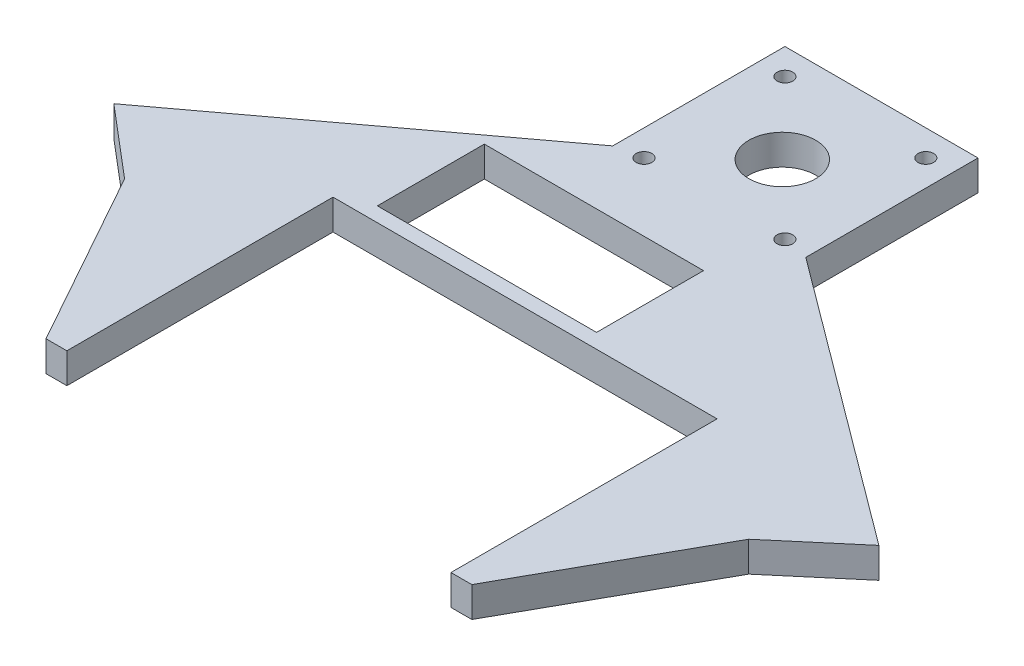
ISO-10303-21;
HEADER;
FILE_DESCRIPTION(('STEP AP214'),'2;1');
FILE_NAME('part.step','',(''),(''),'','','');
FILE_SCHEMA(('AUTOMOTIVE_DESIGN { 1 0 10303 214 1 1 1 1 }'));
ENDSEC;
DATA;
#1=APPLICATION_CONTEXT('core data for automotive mechanical design processes');
#2=APPLICATION_PROTOCOL_DEFINITION('international standard','automotive_design',2000,#1);
#3=PRODUCT_CONTEXT('',#1,'mechanical');
#4=PRODUCT('Part','Part','',(#3));
#5=PRODUCT_RELATED_PRODUCT_CATEGORY('part','',(#4));
#6=PRODUCT_DEFINITION_FORMATION('','',#4);
#7=PRODUCT_DEFINITION_CONTEXT('part definition',#1,'design');
#8=PRODUCT_DEFINITION('design','',#6,#7);
#9=PRODUCT_DEFINITION_SHAPE('','',#8);
#10=(LENGTH_UNIT() NAMED_UNIT(*) SI_UNIT(.MILLI.,.METRE.));
#11=(NAMED_UNIT(*) PLANE_ANGLE_UNIT() SI_UNIT($,.RADIAN.));
#12=(NAMED_UNIT(*) SI_UNIT($,.STERADIAN.) SOLID_ANGLE_UNIT());
#13=UNCERTAINTY_MEASURE_WITH_UNIT(LENGTH_MEASURE(1.E-05),#10,'distance_accuracy_value','');
#14=(GEOMETRIC_REPRESENTATION_CONTEXT(3) GLOBAL_UNCERTAINTY_ASSIGNED_CONTEXT((#13)) GLOBAL_UNIT_ASSIGNED_CONTEXT((#10,
#11,#12)) REPRESENTATION_CONTEXT('',''));
#15=CARTESIAN_POINT('',(0.,0.,0.));
#16=DIRECTION('',(0.,0.,1.));
#17=DIRECTION('',(1.,0.,0.));
#18=AXIS2_PLACEMENT_3D('',#15,#16,#17);
#19=CARTESIAN_POINT('',(0.,5.8,0.));
#20=DIRECTION('',(0.,0.,1.));
#21=DIRECTION('',(1.,0.,0.));
#22=AXIS2_PLACEMENT_3D('',#19,#20,#21);
#23=PLANE('',#22);
#24=DIRECTION('',(-1.,0.,0.));
#25=VECTOR('',#24,1.);
#26=CARTESIAN_POINT('',(0.,0.,0.));
#27=LINE('',#26,#25);
#28=CARTESIAN_POINT('',(18.5,0.,0.));
#29=VERTEX_POINT('',#28);
#30=CARTESIAN_POINT('',(-18.5,0.,0.));
#31=VERTEX_POINT('',#30);
#32=EDGE_CURVE('E302',#29,#31,#27,.T.);
#33=ORIENTED_EDGE('',*,*,#32,.T.);
#34=DIRECTION('',(0.,-1.,0.));
#35=VECTOR('',#34,1.);
#36=CARTESIAN_POINT('',(-18.5,5.8,0.));
#37=LINE('',#36,#35);
#38=CARTESIAN_POINT('',(-18.5,5.8,0.));
#39=VERTEX_POINT('',#38);
#40=EDGE_CURVE('E11',#39,#31,#37,.T.);
#41=ORIENTED_EDGE('',*,*,#40,.F.);
#42=DIRECTION('',(-1.,0.,0.));
#43=VECTOR('',#42,1.);
#44=CARTESIAN_POINT('',(0.,5.8,0.));
#45=LINE('',#44,#43);
#46=CARTESIAN_POINT('',(18.5,5.8,0.));
#47=VERTEX_POINT('',#46);
#48=EDGE_CURVE('E317',#47,#39,#45,.T.);
#49=ORIENTED_EDGE('',*,*,#48,.F.);
#50=DIRECTION('',(0.,-1.,0.));
#51=VECTOR('',#50,1.);
#52=CARTESIAN_POINT('',(18.5,5.8,0.));
#53=LINE('',#52,#51);
#54=EDGE_CURVE('E247',#47,#29,#53,.T.);
#55=ORIENTED_EDGE('',*,*,#54,.T.);
#56=EDGE_LOOP('',(#33,#41,#49,#55));
#57=FACE_BOUND('',#56,.T.);
#58=ADVANCED_FACE('F41',(#57),#23,.F.);
#59=CARTESIAN_POINT('',(-18.5,5.8,0.));
#60=DIRECTION('',(1.,0.,0.));
#61=DIRECTION('',(0.,0.,-1.));
#62=AXIS2_PLACEMENT_3D('',#59,#60,#61);
#63=PLANE('',#62);
#64=DIRECTION('',(0.,0.,1.));
#65=VECTOR('',#64,1.);
#66=CARTESIAN_POINT('',(-18.5,0.,0.));
#67=LINE('',#66,#65);
#68=CARTESIAN_POINT('',(-18.5,0.,33.));
#69=VERTEX_POINT('',#68);
#70=EDGE_CURVE('E345',#31,#69,#67,.T.);
#71=ORIENTED_EDGE('',*,*,#70,.T.);
#72=DIRECTION('',(0.,-1.,0.));
#73=VECTOR('',#72,1.);
#74=CARTESIAN_POINT('',(-18.5,5.8,33.));
#75=LINE('',#74,#73);
#76=CARTESIAN_POINT('',(-18.5,5.8,33.));
#77=VERTEX_POINT('',#76);
#78=EDGE_CURVE('E49',#77,#69,#75,.T.);
#79=ORIENTED_EDGE('',*,*,#78,.F.);
#80=DIRECTION('',(0.,0.,1.));
#81=VECTOR('',#80,1.);
#82=CARTESIAN_POINT('',(-18.5,5.8,0.));
#83=LINE('',#82,#81);
#84=EDGE_CURVE('E320',#39,#77,#83,.T.);
#85=ORIENTED_EDGE('',*,*,#84,.F.);
#86=ORIENTED_EDGE('',*,*,#40,.T.);
#87=EDGE_LOOP('',(#71,#79,#85,#86));
#88=FACE_BOUND('',#87,.T.);
#89=ADVANCED_FACE('F414',(#88),#63,.F.);
#90=CARTESIAN_POINT('',(-18.5,5.8,33.));
#91=DIRECTION('',(0.59712909838521,0.,0.802145148873735));
#92=DIRECTION('',(0.802145148873735,0.,-0.59712909838521));
#93=AXIS2_PLACEMENT_3D('',#90,#91,#92);
#94=PLANE('',#93);
#95=DIRECTION('',(-0.802145148873735,0.,0.59712909838521));
#96=VECTOR('',#95,1.);
#97=CARTESIAN_POINT('',(-18.5,0.,33.));
#98=LINE('',#97,#96);
#99=CARTESIAN_POINT('',(-73.3,0.,73.7939568511438));
#100=VERTEX_POINT('',#99);
#101=EDGE_CURVE('E348',#69,#100,#98,.T.);
#102=ORIENTED_EDGE('',*,*,#101,.T.);
#103=DIRECTION('',(0.,-1.,0.));
#104=VECTOR('',#103,1.);
#105=CARTESIAN_POINT('',(-73.3,5.8,73.7939568511438));
#106=LINE('',#105,#104);
#107=CARTESIAN_POINT('',(-73.3,5.8,73.7939568511438));
#108=VERTEX_POINT('',#107);
#109=EDGE_CURVE('E380',#108,#100,#106,.T.);
#110=ORIENTED_EDGE('',*,*,#109,.F.);
#111=DIRECTION('',(-0.802145148873735,0.,0.59712909838521));
#112=VECTOR('',#111,1.);
#113=CARTESIAN_POINT('',(-18.5,5.8,33.));
#114=LINE('',#113,#112);
#115=EDGE_CURVE('E324',#77,#108,#114,.T.);
#116=ORIENTED_EDGE('',*,*,#115,.F.);
#117=ORIENTED_EDGE('',*,*,#78,.T.);
#118=EDGE_LOOP('',(#102,#110,#116,#117));
#119=FACE_BOUND('',#118,.T.);
#120=ADVANCED_FACE('F389',(#119),#94,.F.);
#121=CARTESIAN_POINT('',(-73.3,5.8,73.7939568511438));
#122=DIRECTION('',(0.646738441638607,0.,-0.762711864406779));
#123=DIRECTION('',(-0.76271186440678,0.,-0.646738441638607));
#124=AXIS2_PLACEMENT_3D('',#121,#122,#123);
#125=PLANE('',#124);
#126=DIRECTION('',(0.76271186440678,0.,0.646738441638607));
#127=VECTOR('',#126,1.);
#128=CARTESIAN_POINT('',(-73.3,0.,73.7939568511438));
#129=LINE('',#128,#127);
#130=CARTESIAN_POINT('',(-59.8,0.,85.2412272681472));
#131=VERTEX_POINT('',#130);
#132=EDGE_CURVE('E351',#100,#131,#129,.T.);
#133=ORIENTED_EDGE('',*,*,#132,.T.);
#134=DIRECTION('',(0.,-1.,0.));
#135=VECTOR('',#134,1.);
#136=CARTESIAN_POINT('',(-59.8,5.8,85.2412272681472));
#137=LINE('',#136,#135);
#138=CARTESIAN_POINT('',(-59.8,5.8,85.2412272681472));
#139=VERTEX_POINT('',#138);
#140=EDGE_CURVE('E376',#139,#131,#137,.T.);
#141=ORIENTED_EDGE('',*,*,#140,.F.);
#142=DIRECTION('',(0.76271186440678,0.,0.646738441638607));
#143=VECTOR('',#142,1.);
#144=CARTESIAN_POINT('',(-73.3,5.8,73.7939568511438));
#145=LINE('',#144,#143);
#146=EDGE_CURVE('E327',#108,#139,#145,.T.);
#147=ORIENTED_EDGE('',*,*,#146,.F.);
#148=ORIENTED_EDGE('',*,*,#109,.T.);
#149=EDGE_LOOP('',(#133,#141,#147,#148));
#150=FACE_BOUND('',#149,.T.);
#151=ADVANCED_FACE('F402',(#150),#125,.F.);
#152=CARTESIAN_POINT('',(-59.8,5.8,85.2412272681472));
#153=DIRECTION('',(0.873301864919303,0.,-0.487179487179487));
#154=DIRECTION('',(-0.487179487179487,0.,-0.873301864919303));
#155=AXIS2_PLACEMENT_3D('',#152,#153,#154);
#156=PLANE('',#155);
#157=DIRECTION('',(0.487179487179487,0.,0.873301864919303));
#158=VECTOR('',#157,1.);
#159=CARTESIAN_POINT('',(-59.8,0.,85.2412272681472));
#160=LINE('',#159,#158);
#161=CARTESIAN_POINT('',(-40.8,0.,119.3));
#162=VERTEX_POINT('',#161);
#163=EDGE_CURVE('E354',#131,#162,#160,.T.);
#164=ORIENTED_EDGE('',*,*,#163,.T.);
#165=DIRECTION('',(0.,-1.,0.));
#166=VECTOR('',#165,1.);
#167=CARTESIAN_POINT('',(-40.8,5.8,119.3));
#168=LINE('',#167,#166);
#169=CARTESIAN_POINT('',(-40.8,5.8,119.3));
#170=VERTEX_POINT('',#169);
#171=EDGE_CURVE('E372',#170,#162,#168,.T.);
#172=ORIENTED_EDGE('',*,*,#171,.F.);
#173=DIRECTION('',(0.487179487179487,0.,0.873301864919303));
#174=VECTOR('',#173,1.);
#175=CARTESIAN_POINT('',(-59.8,5.8,85.2412272681472));
#176=LINE('',#175,#174);
#177=EDGE_CURVE('E330',#139,#170,#176,.T.);
#178=ORIENTED_EDGE('',*,*,#177,.F.);
#179=ORIENTED_EDGE('',*,*,#140,.T.);
#180=EDGE_LOOP('',(#164,#172,#178,#179));
#181=FACE_BOUND('',#180,.T.);
#182=ADVANCED_FACE('F406',(#181),#156,.F.);
#183=CARTESIAN_POINT('',(-40.8,5.8,119.3));
#184=DIRECTION('',(0.,0.,-1.));
#185=DIRECTION('',(-1.,0.,0.));
#186=AXIS2_PLACEMENT_3D('',#183,#184,#185);
#187=PLANE('',#186);
#188=DIRECTION('',(1.,0.,0.));
#189=VECTOR('',#188,1.);
#190=CARTESIAN_POINT('',(-40.8,0.,119.3));
#191=LINE('',#190,#189);
#192=CARTESIAN_POINT('',(-36.8,0.,119.3));
#193=VERTEX_POINT('',#192);
#194=EDGE_CURVE('E357',#162,#193,#191,.T.);
#195=ORIENTED_EDGE('',*,*,#194,.T.);
#196=DIRECTION('',(0.,-1.,0.));
#197=VECTOR('',#196,1.);
#198=CARTESIAN_POINT('',(-36.8,5.8,119.3));
#199=LINE('',#198,#197);
#200=CARTESIAN_POINT('',(-36.8,5.8,119.3));
#201=VERTEX_POINT('',#200);
#202=EDGE_CURVE('E368',#201,#193,#199,.T.);
#203=ORIENTED_EDGE('',*,*,#202,.F.);
#204=DIRECTION('',(1.,0.,0.));
#205=VECTOR('',#204,1.);
#206=CARTESIAN_POINT('',(-40.8,5.8,119.3));
#207=LINE('',#206,#205);
#208=EDGE_CURVE('E333',#170,#201,#207,.T.);
#209=ORIENTED_EDGE('',*,*,#208,.F.);
#210=ORIENTED_EDGE('',*,*,#171,.T.);
#211=EDGE_LOOP('',(#195,#203,#209,#210));
#212=FACE_BOUND('',#211,.T.);
#213=ADVANCED_FACE('F451',(#212),#187,.F.);
#214=CARTESIAN_POINT('',(-36.8,5.8,119.3));
#215=DIRECTION('',(-1.,0.,0.));
#216=DIRECTION('',(0.,0.,1.));
#217=AXIS2_PLACEMENT_3D('',#214,#215,#216);
#218=PLANE('',#217);
#219=DIRECTION('',(0.,0.,-1.));
#220=VECTOR('',#219,1.);
#221=CARTESIAN_POINT('',(-36.8,0.,119.3));
#222=LINE('',#221,#220);
#223=CARTESIAN_POINT('',(-36.8,0.,68.3));
#224=VERTEX_POINT('',#223);
#225=EDGE_CURVE('E360',#193,#224,#222,.T.);
#226=ORIENTED_EDGE('',*,*,#225,.T.);
#227=DIRECTION('',(0.,-1.,0.));
#228=VECTOR('',#227,1.);
#229=CARTESIAN_POINT('',(-36.8,5.8,68.3));
#230=LINE('',#229,#228);
#231=CARTESIAN_POINT('',(-36.8,5.8,68.3));
#232=VERTEX_POINT('',#231);
#233=EDGE_CURVE('E342',#232,#224,#230,.T.);
#234=ORIENTED_EDGE('',*,*,#233,.F.);
#235=DIRECTION('',(0.,0.,-1.));
#236=VECTOR('',#235,1.);
#237=CARTESIAN_POINT('',(-36.8,5.8,119.3));
#238=LINE('',#237,#236);
#239=EDGE_CURVE('E336',#201,#232,#238,.T.);
#240=ORIENTED_EDGE('',*,*,#239,.F.);
#241=ORIENTED_EDGE('',*,*,#202,.T.);
#242=EDGE_LOOP('',(#226,#234,#240,#241));
#243=FACE_BOUND('',#242,.T.);
#244=ADVANCED_FACE('F449',(#243),#218,.F.);
#245=CARTESIAN_POINT('',(-36.8,5.8,68.3));
#246=DIRECTION('',(0.,0.,-1.));
#247=DIRECTION('',(-1.,0.,0.));
#248=AXIS2_PLACEMENT_3D('',#245,#246,#247);
#249=PLANE('',#248);
#250=DIRECTION('',(1.,0.,0.));
#251=VECTOR('',#250,1.);
#252=CARTESIAN_POINT('',(-36.8,0.,68.3));
#253=LINE('',#252,#251);
#254=CARTESIAN_POINT('',(36.8,0.,68.3));
#255=VERTEX_POINT('',#254);
#256=EDGE_CURVE('E321',#224,#255,#253,.T.);
#257=ORIENTED_EDGE('',*,*,#256,.T.);
#258=DIRECTION('',(0.,-1.,0.));
#259=VECTOR('',#258,1.);
#260=CARTESIAN_POINT('',(36.8,5.8,68.3));
#261=LINE('',#260,#259);
#262=CARTESIAN_POINT('',(36.8,5.8,68.3));
#263=VERTEX_POINT('',#262);
#264=EDGE_CURVE('E288',#263,#255,#261,.T.);
#265=ORIENTED_EDGE('',*,*,#264,.F.);
#266=DIRECTION('',(1.,0.,0.));
#267=VECTOR('',#266,1.);
#268=CARTESIAN_POINT('',(-36.8,5.8,68.3));
#269=LINE('',#268,#267);
#270=EDGE_CURVE('E339',#232,#263,#269,.T.);
#271=ORIENTED_EDGE('',*,*,#270,.F.);
#272=ORIENTED_EDGE('',*,*,#233,.T.);
#273=EDGE_LOOP('',(#257,#265,#271,#272));
#274=FACE_BOUND('',#273,.T.);
#275=ADVANCED_FACE('F444',(#274),#249,.F.);
#276=CARTESIAN_POINT('',(0.,5.8,0.));
#277=DIRECTION('',(0.,1.,0.));
#278=DIRECTION('',(0.,0.,1.));
#279=AXIS2_PLACEMENT_3D('',#276,#277,#278);
#280=PLANE('',#279);
#281=DIRECTION('',(0.,0.,1.));
#282=VECTOR('',#281,1.);
#283=CARTESIAN_POINT('',(-31.1,5.8,45.));
#284=LINE('',#283,#282);
#285=CARTESIAN_POINT('',(-31.1,5.8,45.));
#286=VERTEX_POINT('',#285);
#287=CARTESIAN_POINT('',(-31.1,5.8,65.5));
#288=VERTEX_POINT('',#287);
#289=EDGE_CURVE('E56',#286,#288,#284,.T.);
#290=ORIENTED_EDGE('',*,*,#289,.F.);
#291=DIRECTION('',(-1.,0.,0.));
#292=VECTOR('',#291,1.);
#293=CARTESIAN_POINT('',(-31.1,5.8,45.));
#294=LINE('',#293,#292);
#295=CARTESIAN_POINT('',(10.9,5.8,45.));
#296=VERTEX_POINT('',#295);
#297=EDGE_CURVE('E187',#296,#286,#294,.T.);
#298=ORIENTED_EDGE('',*,*,#297,.F.);
#299=DIRECTION('',(0.,0.,-1.));
#300=VECTOR('',#299,1.);
#301=CARTESIAN_POINT('',(10.9,5.8,45.));
#302=LINE('',#301,#300);
#303=CARTESIAN_POINT('',(10.9,5.8,65.5));
#304=VERTEX_POINT('',#303);
#305=EDGE_CURVE('E169',#304,#296,#302,.T.);
#306=ORIENTED_EDGE('',*,*,#305,.F.);
#307=DIRECTION('',(1.,0.,0.));
#308=VECTOR('',#307,1.);
#309=CARTESIAN_POINT('',(-31.1,5.8,65.5));
#310=LINE('',#309,#308);
#311=EDGE_CURVE('E179',#288,#304,#310,.T.);
#312=ORIENTED_EDGE('',*,*,#311,.F.);
#313=EDGE_LOOP('',(#290,#298,#306,#312));
#314=FACE_BOUND('',#313,.T.);
#315=CARTESIAN_POINT('',(13.5,5.8,5.));
#316=DIRECTION('',(0.,-1.,0.));
#317=DIRECTION('',(0.,0.,1.));
#318=AXIS2_PLACEMENT_3D('',#315,#316,#317);
#319=CIRCLE('',#318,1.5);
#320=CARTESIAN_POINT('',(13.5,5.8,6.5));
#321=VERTEX_POINT('',#320);
#322=EDGE_CURVE('E206',#321,#321,#319,.T.);
#323=ORIENTED_EDGE('',*,*,#322,.T.);
#324=EDGE_LOOP('',(#323));
#325=FACE_BOUND('',#324,.T.);
#326=CARTESIAN_POINT('',(13.5,5.8,32.));
#327=DIRECTION('',(0.,-1.,0.));
#328=DIRECTION('',(0.,0.,1.));
#329=AXIS2_PLACEMENT_3D('',#326,#327,#328);
#330=CIRCLE('',#329,1.5);
#331=CARTESIAN_POINT('',(13.5,5.8,33.5));
#332=VERTEX_POINT('',#331);
#333=EDGE_CURVE('E204',#332,#332,#330,.T.);
#334=ORIENTED_EDGE('',*,*,#333,.T.);
#335=EDGE_LOOP('',(#334));
#336=FACE_BOUND('',#335,.T.);
#337=DIRECTION('',(0.,0.,1.));
#338=VECTOR('',#337,1.);
#339=CARTESIAN_POINT('',(18.5,5.8,0.));
#340=LINE('',#339,#338);
#341=CARTESIAN_POINT('',(18.5,5.8,33.));
#342=VERTEX_POINT('',#341);
#343=EDGE_CURVE('E243',#47,#342,#340,.T.);
#344=ORIENTED_EDGE('',*,*,#343,.F.);
#345=ORIENTED_EDGE('',*,*,#48,.T.);
#346=ORIENTED_EDGE('',*,*,#84,.T.);
#347=ORIENTED_EDGE('',*,*,#115,.T.);
#348=ORIENTED_EDGE('',*,*,#146,.T.);
#349=ORIENTED_EDGE('',*,*,#177,.T.);
#350=ORIENTED_EDGE('',*,*,#208,.T.);
#351=ORIENTED_EDGE('',*,*,#239,.T.);
#352=ORIENTED_EDGE('',*,*,#270,.T.);
#353=DIRECTION('',(0.,0.,-1.));
#354=VECTOR('',#353,1.);
#355=CARTESIAN_POINT('',(36.8,5.8,119.3));
#356=LINE('',#355,#354);
#357=CARTESIAN_POINT('',(36.8,5.8,119.3));
#358=VERTEX_POINT('',#357);
#359=EDGE_CURVE('E222',#358,#263,#356,.T.);
#360=ORIENTED_EDGE('',*,*,#359,.F.);
#361=DIRECTION('',(-1.,0.,0.));
#362=VECTOR('',#361,1.);
#363=CARTESIAN_POINT('',(40.8,5.8,119.3));
#364=LINE('',#363,#362);
#365=CARTESIAN_POINT('',(40.8,5.8,119.3));
#366=VERTEX_POINT('',#365);
#367=EDGE_CURVE('E226',#366,#358,#364,.T.);
#368=ORIENTED_EDGE('',*,*,#367,.F.);
#369=DIRECTION('',(-0.487179487179487,0.,0.873301864919303));
#370=VECTOR('',#369,1.);
#371=CARTESIAN_POINT('',(59.8,5.8,85.2412272681472));
#372=LINE('',#371,#370);
#373=CARTESIAN_POINT('',(59.8,5.8,85.2412272681472));
#374=VERTEX_POINT('',#373);
#375=EDGE_CURVE('E231',#374,#366,#372,.T.);
#376=ORIENTED_EDGE('',*,*,#375,.F.);
#377=DIRECTION('',(-0.76271186440678,0.,0.646738441638607));
#378=VECTOR('',#377,1.);
#379=CARTESIAN_POINT('',(73.3,5.8,73.7939568511438));
#380=LINE('',#379,#378);
#381=CARTESIAN_POINT('',(73.3,5.8,73.7939568511438));
#382=VERTEX_POINT('',#381);
#383=EDGE_CURVE('E235',#382,#374,#380,.T.);
#384=ORIENTED_EDGE('',*,*,#383,.F.);
#385=DIRECTION('',(0.802145148873735,0.,0.59712909838521));
#386=VECTOR('',#385,1.);
#387=CARTESIAN_POINT('',(18.5,5.8,33.));
#388=LINE('',#387,#386);
#389=EDGE_CURVE('E239',#342,#382,#388,.T.);
#390=ORIENTED_EDGE('',*,*,#389,.F.);
#391=EDGE_LOOP('',(#344,#345,#346,#347,#348,#349,#350,#351,#352,#360,#368,#376,#384,#390));
#392=FACE_BOUND('',#391,.T.);
#393=CARTESIAN_POINT('',(-13.5,5.8,5.));
#394=DIRECTION('',(0.,1.,0.));
#395=DIRECTION('',(0.,0.,1.));
#396=AXIS2_PLACEMENT_3D('',#393,#394,#395);
#397=CIRCLE('',#396,1.5);
#398=CARTESIAN_POINT('',(-13.5,5.8,6.5));
#399=VERTEX_POINT('',#398);
#400=EDGE_CURVE('E293',#399,#399,#397,.T.);
#401=ORIENTED_EDGE('',*,*,#400,.F.);
#402=EDGE_LOOP('',(#401));
#403=FACE_BOUND('',#402,.T.);
#404=CARTESIAN_POINT('',(0.,5.8,19.));
#405=DIRECTION('',(0.,1.,0.));
#406=DIRECTION('',(0.,0.,1.));
#407=AXIS2_PLACEMENT_3D('',#404,#405,#406);
#408=CIRCLE('',#407,6.4);
#409=CARTESIAN_POINT('',(0.,5.8,25.4));
#410=VERTEX_POINT('',#409);
#411=EDGE_CURVE('E303',#410,#410,#408,.T.);
#412=ORIENTED_EDGE('',*,*,#411,.F.);
#413=EDGE_LOOP('',(#412));
#414=FACE_BOUND('',#413,.T.);
#415=CARTESIAN_POINT('',(-13.5,5.8,32.));
#416=DIRECTION('',(0.,1.,0.));
#417=DIRECTION('',(0.,0.,1.));
#418=AXIS2_PLACEMENT_3D('',#415,#416,#417);
#419=CIRCLE('',#418,1.5);
#420=CARTESIAN_POINT('',(-13.5,5.8,33.5));
#421=VERTEX_POINT('',#420);
#422=EDGE_CURVE('E292',#421,#421,#419,.T.);
#423=ORIENTED_EDGE('',*,*,#422,.F.);
#424=EDGE_LOOP('',(#423));
#425=FACE_BOUND('',#424,.T.);
#426=ADVANCED_FACE('F184',(#314,#325,#336,#392,#403,#414,#425),#280,.T.);
#427=CARTESIAN_POINT('',(0.,0.,0.));
#428=DIRECTION('',(0.,1.,0.));
#429=DIRECTION('',(0.,0.,1.));
#430=AXIS2_PLACEMENT_3D('',#427,#428,#429);
#431=PLANE('',#430);
#432=DIRECTION('',(1.,0.,0.));
#433=VECTOR('',#432,1.);
#434=CARTESIAN_POINT('',(-31.1,0.,45.));
#435=LINE('',#434,#433);
#436=CARTESIAN_POINT('',(-31.1,0.,45.));
#437=VERTEX_POINT('',#436);
#438=CARTESIAN_POINT('',(10.9,0.,45.));
#439=VERTEX_POINT('',#438);
#440=EDGE_CURVE('E661',#437,#439,#435,.T.);
#441=ORIENTED_EDGE('',*,*,#440,.F.);
#442=DIRECTION('',(0.,0.,-1.));
#443=VECTOR('',#442,1.);
#444=CARTESIAN_POINT('',(-31.1,0.,45.));
#445=LINE('',#444,#443);
#446=CARTESIAN_POINT('',(-31.1,0.,65.5));
#447=VERTEX_POINT('',#446);
#448=EDGE_CURVE('E205',#447,#437,#445,.T.);
#449=ORIENTED_EDGE('',*,*,#448,.F.);
#450=DIRECTION('',(-1.,0.,0.));
#451=VECTOR('',#450,1.);
#452=CARTESIAN_POINT('',(-31.1,0.,65.5));
#453=LINE('',#452,#451);
#454=CARTESIAN_POINT('',(10.9,0.,65.5));
#455=VERTEX_POINT('',#454);
#456=EDGE_CURVE('E201',#455,#447,#453,.T.);
#457=ORIENTED_EDGE('',*,*,#456,.F.);
#458=DIRECTION('',(0.,0.,1.));
#459=VECTOR('',#458,1.);
#460=CARTESIAN_POINT('',(10.9,0.,45.));
#461=LINE('',#460,#459);
#462=EDGE_CURVE('E172',#439,#455,#461,.T.);
#463=ORIENTED_EDGE('',*,*,#462,.F.);
#464=EDGE_LOOP('',(#441,#449,#457,#463));
#465=FACE_BOUND('',#464,.T.);
#466=CARTESIAN_POINT('',(13.5,0.,5.));
#467=DIRECTION('',(0.,1.,0.));
#468=DIRECTION('',(0.,0.,1.));
#469=AXIS2_PLACEMENT_3D('',#466,#467,#468);
#470=CIRCLE('',#469,1.5);
#471=CARTESIAN_POINT('',(13.5,0.,6.5));
#472=VERTEX_POINT('',#471);
#473=EDGE_CURVE('E210',#472,#472,#470,.T.);
#474=ORIENTED_EDGE('',*,*,#473,.T.);
#475=EDGE_LOOP('',(#474));
#476=FACE_BOUND('',#475,.T.);
#477=CARTESIAN_POINT('',(0.,0.,19.));
#478=DIRECTION('',(0.,1.,0.));
#479=DIRECTION('',(0.,0.,1.));
#480=AXIS2_PLACEMENT_3D('',#477,#478,#479);
#481=CIRCLE('',#480,6.4);
#482=CARTESIAN_POINT('',(0.,0.,25.4));
#483=VERTEX_POINT('',#482);
#484=EDGE_CURVE('E298',#483,#483,#481,.F.);
#485=ORIENTED_EDGE('',*,*,#484,.F.);
#486=EDGE_LOOP('',(#485));
#487=FACE_BOUND('',#486,.T.);
#488=CARTESIAN_POINT('',(13.5,0.,32.));
#489=DIRECTION('',(0.,1.,0.));
#490=DIRECTION('',(0.,0.,1.));
#491=AXIS2_PLACEMENT_3D('',#488,#489,#490);
#492=CIRCLE('',#491,1.5);
#493=CARTESIAN_POINT('',(13.5,0.,33.5));
#494=VERTEX_POINT('',#493);
#495=EDGE_CURVE('E211',#494,#494,#492,.T.);
#496=ORIENTED_EDGE('',*,*,#495,.T.);
#497=EDGE_LOOP('',(#496));
#498=FACE_BOUND('',#497,.T.);
#499=ORIENTED_EDGE('',*,*,#32,.F.);
#500=DIRECTION('',(0.,0.,1.));
#501=VECTOR('',#500,1.);
#502=CARTESIAN_POINT('',(18.5,0.,0.));
#503=LINE('',#502,#501);
#504=CARTESIAN_POINT('',(18.5,0.,33.));
#505=VERTEX_POINT('',#504);
#506=EDGE_CURVE('E227',#29,#505,#503,.T.);
#507=ORIENTED_EDGE('',*,*,#506,.T.);
#508=DIRECTION('',(0.802145148873735,0.,0.59712909838521));
#509=VECTOR('',#508,1.);
#510=CARTESIAN_POINT('',(18.5,0.,33.));
#511=LINE('',#510,#509);
#512=CARTESIAN_POINT('',(73.3,0.,73.7939568511438));
#513=VERTEX_POINT('',#512);
#514=EDGE_CURVE('E263',#505,#513,#511,.T.);
#515=ORIENTED_EDGE('',*,*,#514,.T.);
#516=DIRECTION('',(-0.76271186440678,0.,0.646738441638607));
#517=VECTOR('',#516,1.);
#518=CARTESIAN_POINT('',(73.3,0.,73.7939568511438));
#519=LINE('',#518,#517);
#520=CARTESIAN_POINT('',(59.8,0.,85.2412272681472));
#521=VERTEX_POINT('',#520);
#522=EDGE_CURVE('E259',#513,#521,#519,.T.);
#523=ORIENTED_EDGE('',*,*,#522,.T.);
#524=DIRECTION('',(-0.487179487179487,0.,0.873301864919303));
#525=VECTOR('',#524,1.);
#526=CARTESIAN_POINT('',(59.8,0.,85.2412272681472));
#527=LINE('',#526,#525);
#528=CARTESIAN_POINT('',(40.8,0.,119.3));
#529=VERTEX_POINT('',#528);
#530=EDGE_CURVE('E255',#521,#529,#527,.T.);
#531=ORIENTED_EDGE('',*,*,#530,.T.);
#532=DIRECTION('',(-1.,0.,0.));
#533=VECTOR('',#532,1.);
#534=CARTESIAN_POINT('',(40.8,0.,119.3));
#535=LINE('',#534,#533);
#536=CARTESIAN_POINT('',(36.8,0.,119.3));
#537=VERTEX_POINT('',#536);
#538=EDGE_CURVE('E251',#529,#537,#535,.T.);
#539=ORIENTED_EDGE('',*,*,#538,.T.);
#540=DIRECTION('',(0.,0.,-1.));
#541=VECTOR('',#540,1.);
#542=CARTESIAN_POINT('',(36.8,0.,119.3));
#543=LINE('',#542,#541);
#544=EDGE_CURVE('E215',#537,#255,#543,.T.);
#545=ORIENTED_EDGE('',*,*,#544,.T.);
#546=ORIENTED_EDGE('',*,*,#256,.F.);
#547=ORIENTED_EDGE('',*,*,#225,.F.);
#548=ORIENTED_EDGE('',*,*,#194,.F.);
#549=ORIENTED_EDGE('',*,*,#163,.F.);
#550=ORIENTED_EDGE('',*,*,#132,.F.);
#551=ORIENTED_EDGE('',*,*,#101,.F.);
#552=ORIENTED_EDGE('',*,*,#70,.F.);
#553=EDGE_LOOP('',(#499,#507,#515,#523,#531,#539,#545,#546,#547,#548,#549,#550,#551,#552));
#554=FACE_BOUND('',#553,.T.);
#555=CARTESIAN_POINT('',(-13.5,0.,5.));
#556=DIRECTION('',(0.,1.,0.));
#557=DIRECTION('',(0.,0.,1.));
#558=AXIS2_PLACEMENT_3D('',#555,#556,#557);
#559=CIRCLE('',#558,1.5);
#560=CARTESIAN_POINT('',(-13.5,0.,6.5));
#561=VERTEX_POINT('',#560);
#562=EDGE_CURVE('E297',#561,#561,#559,.F.);
#563=ORIENTED_EDGE('',*,*,#562,.F.);
#564=EDGE_LOOP('',(#563));
#565=FACE_BOUND('',#564,.T.);
#566=CARTESIAN_POINT('',(-13.5,0.,32.));
#567=DIRECTION('',(0.,1.,0.));
#568=DIRECTION('',(0.,0.,1.));
#569=AXIS2_PLACEMENT_3D('',#566,#567,#568);
#570=CIRCLE('',#569,1.5);
#571=CARTESIAN_POINT('',(-13.5,0.,33.5));
#572=VERTEX_POINT('',#571);
#573=EDGE_CURVE('E307',#572,#572,#570,.F.);
#574=ORIENTED_EDGE('',*,*,#573,.F.);
#575=EDGE_LOOP('',(#574));
#576=FACE_BOUND('',#575,.T.);
#577=ADVANCED_FACE('F396',(#465,#476,#487,#498,#554,#565,#576),#431,.F.);
#578=CARTESIAN_POINT('',(-13.5,-18.1019335983756,32.));
#579=DIRECTION('',(0.,1.,0.));
#580=DIRECTION('',(0.,0.,1.));
#581=AXIS2_PLACEMENT_3D('',#578,#579,#580);
#582=CYLINDRICAL_SURFACE('',#581,1.5);
#583=ORIENTED_EDGE('',*,*,#573,.T.);
#584=EDGE_LOOP('',(#583));
#585=FACE_BOUND('',#584,.T.);
#586=ORIENTED_EDGE('',*,*,#422,.T.);
#587=EDGE_LOOP('',(#586));
#588=FACE_BOUND('',#587,.T.);
#589=ADVANCED_FACE('F495',(#585,#588),#582,.F.);
#590=CARTESIAN_POINT('',(0.,-18.1019335983756,19.));
#591=DIRECTION('',(0.,1.,0.));
#592=DIRECTION('',(0.,0.,1.));
#593=AXIS2_PLACEMENT_3D('',#590,#591,#592);
#594=CYLINDRICAL_SURFACE('',#593,6.4);
#595=ORIENTED_EDGE('',*,*,#411,.T.);
#596=EDGE_LOOP('',(#595));
#597=FACE_BOUND('',#596,.T.);
#598=ORIENTED_EDGE('',*,*,#484,.T.);
#599=EDGE_LOOP('',(#598));
#600=FACE_BOUND('',#599,.T.);
#601=ADVANCED_FACE('F500',(#597,#600),#594,.F.);
#602=CARTESIAN_POINT('',(-13.5,-18.1019335983756,5.));
#603=DIRECTION('',(0.,1.,0.));
#604=DIRECTION('',(0.,0.,1.));
#605=AXIS2_PLACEMENT_3D('',#602,#603,#604);
#606=CYLINDRICAL_SURFACE('',#605,1.5);
#607=ORIENTED_EDGE('',*,*,#562,.T.);
#608=EDGE_LOOP('',(#607));
#609=FACE_BOUND('',#608,.T.);
#610=ORIENTED_EDGE('',*,*,#400,.T.);
#611=EDGE_LOOP('',(#610));
#612=FACE_BOUND('',#611,.T.);
#613=ADVANCED_FACE('F510',(#609,#612),#606,.F.);
#614=CARTESIAN_POINT('',(36.8,5.8,119.3));
#615=DIRECTION('',(-1.,0.,0.));
#616=DIRECTION('',(0.,0.,1.));
#617=AXIS2_PLACEMENT_3D('',#614,#615,#616);
#618=PLANE('',#617);
#619=ORIENTED_EDGE('',*,*,#544,.F.);
#620=DIRECTION('',(0.,-1.,0.));
#621=VECTOR('',#620,1.);
#622=CARTESIAN_POINT('',(36.8,5.8,119.3));
#623=LINE('',#622,#621);
#624=EDGE_CURVE('E285',#358,#537,#623,.T.);
#625=ORIENTED_EDGE('',*,*,#624,.F.);
#626=ORIENTED_EDGE('',*,*,#359,.T.);
#627=ORIENTED_EDGE('',*,*,#264,.T.);
#628=EDGE_LOOP('',(#619,#625,#626,#627));
#629=FACE_BOUND('',#628,.T.);
#630=ADVANCED_FACE('F439',(#629),#618,.T.);
#631=CARTESIAN_POINT('',(40.8,5.8,119.3));
#632=DIRECTION('',(0.,0.,1.));
#633=DIRECTION('',(1.,0.,0.));
#634=AXIS2_PLACEMENT_3D('',#631,#632,#633);
#635=PLANE('',#634);
#636=ORIENTED_EDGE('',*,*,#538,.F.);
#637=DIRECTION('',(0.,-1.,0.));
#638=VECTOR('',#637,1.);
#639=CARTESIAN_POINT('',(40.8,5.8,119.3));
#640=LINE('',#639,#638);
#641=EDGE_CURVE('E282',#366,#529,#640,.T.);
#642=ORIENTED_EDGE('',*,*,#641,.F.);
#643=ORIENTED_EDGE('',*,*,#367,.T.);
#644=ORIENTED_EDGE('',*,*,#624,.T.);
#645=EDGE_LOOP('',(#636,#642,#643,#644));
#646=FACE_BOUND('',#645,.T.);
#647=ADVANCED_FACE('F435',(#646),#635,.T.);
#648=CARTESIAN_POINT('',(59.8,5.8,85.2412272681472));
#649=DIRECTION('',(0.873301864919303,0.,0.487179487179487));
#650=DIRECTION('',(0.487179487179487,0.,-0.873301864919303));
#651=AXIS2_PLACEMENT_3D('',#648,#649,#650);
#652=PLANE('',#651);
#653=ORIENTED_EDGE('',*,*,#530,.F.);
#654=DIRECTION('',(0.,-1.,0.));
#655=VECTOR('',#654,1.);
#656=CARTESIAN_POINT('',(59.8,5.8,85.2412272681472));
#657=LINE('',#656,#655);
#658=EDGE_CURVE('E279',#374,#521,#657,.T.);
#659=ORIENTED_EDGE('',*,*,#658,.F.);
#660=ORIENTED_EDGE('',*,*,#375,.T.);
#661=ORIENTED_EDGE('',*,*,#641,.T.);
#662=EDGE_LOOP('',(#653,#659,#660,#661));
#663=FACE_BOUND('',#662,.T.);
#664=ADVANCED_FACE('F431',(#663),#652,.T.);
#665=CARTESIAN_POINT('',(73.3,5.8,73.7939568511438));
#666=DIRECTION('',(0.646738441638607,0.,0.762711864406779));
#667=DIRECTION('',(0.76271186440678,0.,-0.646738441638607));
#668=AXIS2_PLACEMENT_3D('',#665,#666,#667);
#669=PLANE('',#668);
#670=ORIENTED_EDGE('',*,*,#522,.F.);
#671=DIRECTION('',(0.,-1.,0.));
#672=VECTOR('',#671,1.);
#673=CARTESIAN_POINT('',(73.3,5.8,73.7939568511438));
#674=LINE('',#673,#672);
#675=EDGE_CURVE('E276',#382,#513,#674,.T.);
#676=ORIENTED_EDGE('',*,*,#675,.F.);
#677=ORIENTED_EDGE('',*,*,#383,.T.);
#678=ORIENTED_EDGE('',*,*,#658,.T.);
#679=EDGE_LOOP('',(#670,#676,#677,#678));
#680=FACE_BOUND('',#679,.T.);
#681=ADVANCED_FACE('F427',(#680),#669,.T.);
#682=CARTESIAN_POINT('',(18.5,5.8,33.));
#683=DIRECTION('',(0.59712909838521,0.,-0.802145148873735));
#684=DIRECTION('',(-0.802145148873735,0.,-0.59712909838521));
#685=AXIS2_PLACEMENT_3D('',#682,#683,#684);
#686=PLANE('',#685);
#687=ORIENTED_EDGE('',*,*,#514,.F.);
#688=DIRECTION('',(0.,-1.,0.));
#689=VECTOR('',#688,1.);
#690=CARTESIAN_POINT('',(18.5,5.8,33.));
#691=LINE('',#690,#689);
#692=EDGE_CURVE('E273',#342,#505,#691,.T.);
#693=ORIENTED_EDGE('',*,*,#692,.F.);
#694=ORIENTED_EDGE('',*,*,#389,.T.);
#695=ORIENTED_EDGE('',*,*,#675,.T.);
#696=EDGE_LOOP('',(#687,#693,#694,#695));
#697=FACE_BOUND('',#696,.T.);
#698=ADVANCED_FACE('F423',(#697),#686,.T.);
#699=CARTESIAN_POINT('',(18.5,5.8,0.));
#700=DIRECTION('',(1.,0.,0.));
#701=DIRECTION('',(0.,0.,-1.));
#702=AXIS2_PLACEMENT_3D('',#699,#700,#701);
#703=PLANE('',#702);
#704=ORIENTED_EDGE('',*,*,#506,.F.);
#705=ORIENTED_EDGE('',*,*,#54,.F.);
#706=ORIENTED_EDGE('',*,*,#343,.T.);
#707=ORIENTED_EDGE('',*,*,#692,.T.);
#708=EDGE_LOOP('',(#704,#705,#706,#707));
#709=FACE_BOUND('',#708,.T.);
#710=ADVANCED_FACE('F420',(#709),#703,.T.);
#711=CARTESIAN_POINT('',(13.5,-18.1019335983756,32.));
#712=DIRECTION('',(0.,1.,0.));
#713=DIRECTION('',(0.,0.,1.));
#714=AXIS2_PLACEMENT_3D('',#711,#712,#713);
#715=CYLINDRICAL_SURFACE('',#714,1.5);
#716=ORIENTED_EDGE('',*,*,#495,.F.);
#717=EDGE_LOOP('',(#716));
#718=FACE_BOUND('',#717,.T.);
#719=ORIENTED_EDGE('',*,*,#333,.F.);
#720=EDGE_LOOP('',(#719));
#721=FACE_BOUND('',#720,.T.);
#722=ADVANCED_FACE('F588',(#718,#721),#715,.F.);
#723=CARTESIAN_POINT('',(13.5,-18.1019335983756,5.));
#724=DIRECTION('',(0.,1.,0.));
#725=DIRECTION('',(0.,0.,1.));
#726=AXIS2_PLACEMENT_3D('',#723,#724,#725);
#727=CYLINDRICAL_SURFACE('',#726,1.5);
#728=ORIENTED_EDGE('',*,*,#473,.F.);
#729=EDGE_LOOP('',(#728));
#730=FACE_BOUND('',#729,.T.);
#731=ORIENTED_EDGE('',*,*,#322,.F.);
#732=EDGE_LOOP('',(#731));
#733=FACE_BOUND('',#732,.T.);
#734=ADVANCED_FACE('F596',(#730,#733),#727,.F.);
#735=CARTESIAN_POINT('',(-31.1,-46.7359604587303,45.));
#736=DIRECTION('',(-1.,0.,0.));
#737=DIRECTION('',(0.,0.,1.));
#738=AXIS2_PLACEMENT_3D('',#735,#736,#737);
#739=PLANE('',#738);
#740=ORIENTED_EDGE('',*,*,#448,.T.);
#741=DIRECTION('',(0.,1.,0.));
#742=VECTOR('',#741,1.);
#743=CARTESIAN_POINT('',(-31.1,-46.7359604587303,45.));
#744=LINE('',#743,#742);
#745=EDGE_CURVE('E194',#437,#286,#744,.T.);
#746=ORIENTED_EDGE('',*,*,#745,.T.);
#747=ORIENTED_EDGE('',*,*,#289,.T.);
#748=DIRECTION('',(0.,1.,0.));
#749=VECTOR('',#748,1.);
#750=CARTESIAN_POINT('',(-31.1,-46.7359604587303,65.5));
#751=LINE('',#750,#749);
#752=EDGE_CURVE('E176',#447,#288,#751,.T.);
#753=ORIENTED_EDGE('',*,*,#752,.F.);
#754=EDGE_LOOP('',(#740,#746,#747,#753));
#755=FACE_BOUND('',#754,.T.);
#756=ADVANCED_FACE('F606',(#755),#739,.F.);
#757=CARTESIAN_POINT('',(-31.1,-46.7359604587303,45.));
#758=DIRECTION('',(0.,0.,-1.));
#759=DIRECTION('',(-1.,0.,0.));
#760=AXIS2_PLACEMENT_3D('',#757,#758,#759);
#761=PLANE('',#760);
#762=ORIENTED_EDGE('',*,*,#440,.T.);
#763=DIRECTION('',(0.,1.,0.));
#764=VECTOR('',#763,1.);
#765=CARTESIAN_POINT('',(10.9,-46.7359604587303,45.));
#766=LINE('',#765,#764);
#767=EDGE_CURVE('E175',#439,#296,#766,.T.);
#768=ORIENTED_EDGE('',*,*,#767,.T.);
#769=ORIENTED_EDGE('',*,*,#297,.T.);
#770=ORIENTED_EDGE('',*,*,#745,.F.);
#771=EDGE_LOOP('',(#762,#768,#769,#770));
#772=FACE_BOUND('',#771,.T.);
#773=ADVANCED_FACE('F630',(#772),#761,.F.);
#774=CARTESIAN_POINT('',(10.9,-46.7359604587303,45.));
#775=DIRECTION('',(1.,0.,0.));
#776=DIRECTION('',(0.,0.,-1.));
#777=AXIS2_PLACEMENT_3D('',#774,#775,#776);
#778=PLANE('',#777);
#779=ORIENTED_EDGE('',*,*,#462,.T.);
#780=DIRECTION('',(0.,1.,0.));
#781=VECTOR('',#780,1.);
#782=CARTESIAN_POINT('',(10.9,-46.7359604587303,65.5));
#783=LINE('',#782,#781);
#784=EDGE_CURVE('E64',#455,#304,#783,.T.);
#785=ORIENTED_EDGE('',*,*,#784,.T.);
#786=ORIENTED_EDGE('',*,*,#305,.T.);
#787=ORIENTED_EDGE('',*,*,#767,.F.);
#788=EDGE_LOOP('',(#779,#785,#786,#787));
#789=FACE_BOUND('',#788,.T.);
#790=ADVANCED_FACE('F166',(#789),#778,.F.);
#791=CARTESIAN_POINT('',(-31.1,-46.7359604587303,65.5));
#792=DIRECTION('',(0.,0.,1.));
#793=DIRECTION('',(1.,0.,0.));
#794=AXIS2_PLACEMENT_3D('',#791,#792,#793);
#795=PLANE('',#794);
#796=ORIENTED_EDGE('',*,*,#456,.T.);
#797=ORIENTED_EDGE('',*,*,#752,.T.);
#798=ORIENTED_EDGE('',*,*,#311,.T.);
#799=ORIENTED_EDGE('',*,*,#784,.F.);
#800=EDGE_LOOP('',(#796,#797,#798,#799));
#801=FACE_BOUND('',#800,.T.);
#802=ADVANCED_FACE('F180',(#801),#795,.F.);
#803=CLOSED_SHELL('',(#58,#89,#120,#151,#182,#213,#244,#275,#426,#577,#589,#601,#613,#630,#647,
#664,#681,#698,#710,#722,#734,#756,#773,#790,#802));
#804=MANIFOLD_SOLID_BREP('B2',#803);
#805=ADVANCED_BREP_SHAPE_REPRESENTATION('',(#18,#804),#14);
#806=SHAPE_DEFINITION_REPRESENTATION(#9,#805);
ENDSEC;
END-ISO-10303-21;
